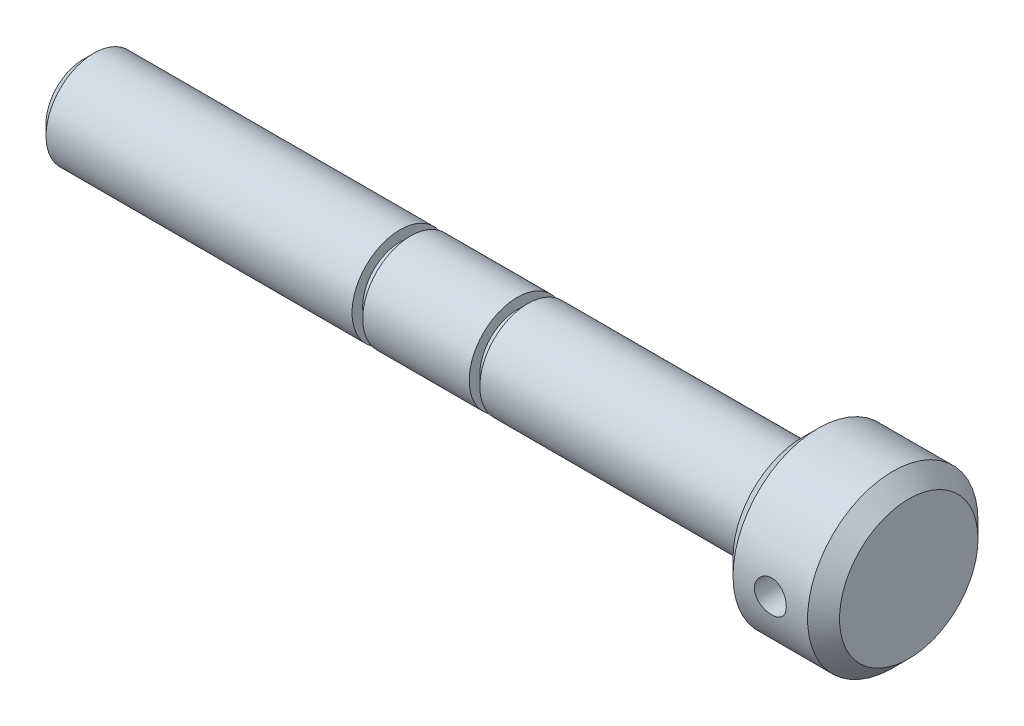
ISO-10303-21;
HEADER;
FILE_DESCRIPTION(('STEP AP214'),'2;1');
FILE_NAME('part.step','',(''),(''),'','','');
FILE_SCHEMA(('AUTOMOTIVE_DESIGN { 1 0 10303 214 1 1 1 1 }'));
ENDSEC;
DATA;
#1=APPLICATION_CONTEXT('core data for automotive mechanical design processes');
#2=APPLICATION_PROTOCOL_DEFINITION('international standard','automotive_design',2000,#1);
#3=PRODUCT_CONTEXT('',#1,'mechanical');
#4=PRODUCT('Part','Part','',(#3));
#5=PRODUCT_RELATED_PRODUCT_CATEGORY('part','',(#4));
#6=PRODUCT_DEFINITION_FORMATION('','',#4);
#7=PRODUCT_DEFINITION_CONTEXT('part definition',#1,'design');
#8=PRODUCT_DEFINITION('design','',#6,#7);
#9=PRODUCT_DEFINITION_SHAPE('','',#8);
#10=(LENGTH_UNIT() NAMED_UNIT(*) SI_UNIT(.MILLI.,.METRE.));
#11=(NAMED_UNIT(*) PLANE_ANGLE_UNIT() SI_UNIT($,.RADIAN.));
#12=(NAMED_UNIT(*) SI_UNIT($,.STERADIAN.) SOLID_ANGLE_UNIT());
#13=UNCERTAINTY_MEASURE_WITH_UNIT(LENGTH_MEASURE(1.E-05),#10,'distance_accuracy_value','');
#14=(GEOMETRIC_REPRESENTATION_CONTEXT(3) GLOBAL_UNCERTAINTY_ASSIGNED_CONTEXT((#13)) GLOBAL_UNIT_ASSIGNED_CONTEXT((#10,
#11,#12)) REPRESENTATION_CONTEXT('',''));
#15=CARTESIAN_POINT('',(0.,0.,0.));
#16=DIRECTION('',(0.,0.,1.));
#17=DIRECTION('',(1.,0.,0.));
#18=AXIS2_PLACEMENT_3D('',#15,#16,#17);
#19=CARTESIAN_POINT('',(0.,0.,0.));
#20=DIRECTION('',(-1.,0.,0.));
#21=DIRECTION('',(0.,0.,1.));
#22=AXIS2_PLACEMENT_3D('',#19,#20,#21);
#23=PLANE('',#22);
#24=CARTESIAN_POINT('',(0.,0.,0.));
#25=DIRECTION('',(-1.,0.,0.));
#26=DIRECTION('',(0.,0.,1.));
#27=AXIS2_PLACEMENT_3D('',#24,#25,#26);
#28=CIRCLE('',#27,6.99999999999992);
#29=CARTESIAN_POINT('',(0.,0.,6.99999999999992));
#30=VERTEX_POINT('',#29);
#31=EDGE_CURVE('E10',#30,#30,#28,.T.);
#32=ORIENTED_EDGE('',*,*,#31,.T.);
#33=EDGE_LOOP('',(#32));
#34=FACE_BOUND('',#33,.T.);
#35=ADVANCED_FACE('F45',(#34),#23,.T.);
#36=CARTESIAN_POINT('',(155.,0.,0.));
#37=DIRECTION('',(1.,0.,0.));
#38=DIRECTION('',(0.,0.,-1.));
#39=AXIS2_PLACEMENT_3D('',#36,#37,#38);
#40=CYLINDRICAL_SURFACE('',#39,9.);
#41=CARTESIAN_POINT('',(2.00000000000006,0.,0.));
#42=DIRECTION('',(-1.,0.,0.));
#43=DIRECTION('',(0.,0.,1.));
#44=AXIS2_PLACEMENT_3D('',#41,#42,#43);
#45=CIRCLE('',#44,9.);
#46=CARTESIAN_POINT('',(2.00000000000006,0.,9.));
#47=VERTEX_POINT('',#46);
#48=EDGE_CURVE('E59',#47,#47,#45,.F.);
#49=ORIENTED_EDGE('',*,*,#48,.T.);
#50=EDGE_LOOP('',(#49));
#51=FACE_BOUND('',#50,.T.);
#52=CARTESIAN_POINT('',(59.46,0.,0.));
#53=DIRECTION('',(1.,0.,0.));
#54=DIRECTION('',(0.,0.,-1.));
#55=AXIS2_PLACEMENT_3D('',#52,#53,#54);
#56=CIRCLE('',#55,9.);
#57=CARTESIAN_POINT('',(59.46,0.,-9.));
#58=VERTEX_POINT('',#57);
#59=EDGE_CURVE('E131',#58,#58,#56,.T.);
#60=ORIENTED_EDGE('',*,*,#59,.F.);
#61=EDGE_LOOP('',(#60));
#62=FACE_BOUND('',#61,.T.);
#63=ADVANCED_FACE('F96',(#51,#62),#40,.T.);
#64=CARTESIAN_POINT('',(59.46,9.,0.));
#65=DIRECTION('',(1.,0.,0.));
#66=DIRECTION('',(0.,0.,-1.));
#67=AXIS2_PLACEMENT_3D('',#64,#65,#66);
#68=PLANE('',#67);
#69=ORIENTED_EDGE('',*,*,#59,.T.);
#70=EDGE_LOOP('',(#69));
#71=FACE_BOUND('',#70,.T.);
#72=CARTESIAN_POINT('',(59.46,0.,0.));
#73=DIRECTION('',(1.,0.,0.));
#74=DIRECTION('',(0.,0.,-1.));
#75=AXIS2_PLACEMENT_3D('',#72,#73,#74);
#76=CIRCLE('',#75,7.);
#77=CARTESIAN_POINT('',(59.46,0.,-7.));
#78=VERTEX_POINT('',#77);
#79=EDGE_CURVE('E134',#78,#78,#76,.T.);
#80=ORIENTED_EDGE('',*,*,#79,.F.);
#81=EDGE_LOOP('',(#80));
#82=FACE_BOUND('',#81,.T.);
#83=ADVANCED_FACE('F101',(#71,#82),#68,.T.);
#84=CARTESIAN_POINT('',(155.,0.,0.));
#85=DIRECTION('',(1.,0.,0.));
#86=DIRECTION('',(0.,0.,-1.));
#87=AXIS2_PLACEMENT_3D('',#84,#85,#86);
#88=CYLINDRICAL_SURFACE('',#87,7.);
#89=ORIENTED_EDGE('',*,*,#79,.T.);
#90=EDGE_LOOP('',(#89));
#91=FACE_BOUND('',#90,.T.);
#92=CARTESIAN_POINT('',(61.46,0.,0.));
#93=DIRECTION('',(1.,0.,0.));
#94=DIRECTION('',(0.,0.,-1.));
#95=AXIS2_PLACEMENT_3D('',#92,#93,#94);
#96=CIRCLE('',#95,7.);
#97=CARTESIAN_POINT('',(61.46,0.,-7.));
#98=VERTEX_POINT('',#97);
#99=EDGE_CURVE('E137',#98,#98,#96,.T.);
#100=ORIENTED_EDGE('',*,*,#99,.F.);
#101=EDGE_LOOP('',(#100));
#102=FACE_BOUND('',#101,.T.);
#103=ADVANCED_FACE('F197',(#91,#102),#88,.T.);
#104=CARTESIAN_POINT('',(61.46,7.,0.));
#105=DIRECTION('',(-1.,0.,0.));
#106=DIRECTION('',(0.,0.,1.));
#107=AXIS2_PLACEMENT_3D('',#104,#105,#106);
#108=PLANE('',#107);
#109=ORIENTED_EDGE('',*,*,#99,.T.);
#110=EDGE_LOOP('',(#109));
#111=FACE_BOUND('',#110,.T.);
#112=CARTESIAN_POINT('',(61.46,0.,0.));
#113=DIRECTION('',(1.,0.,0.));
#114=DIRECTION('',(0.,0.,-1.));
#115=AXIS2_PLACEMENT_3D('',#112,#113,#114);
#116=CIRCLE('',#115,9.);
#117=CARTESIAN_POINT('',(61.46,0.,-9.));
#118=VERTEX_POINT('',#117);
#119=EDGE_CURVE('E140',#118,#118,#116,.T.);
#120=ORIENTED_EDGE('',*,*,#119,.F.);
#121=EDGE_LOOP('',(#120));
#122=FACE_BOUND('',#121,.T.);
#123=ADVANCED_FACE('F193',(#111,#122),#108,.T.);
#124=CARTESIAN_POINT('',(155.,0.,0.));
#125=DIRECTION('',(1.,0.,0.));
#126=DIRECTION('',(0.,0.,-1.));
#127=AXIS2_PLACEMENT_3D('',#124,#125,#126);
#128=CYLINDRICAL_SURFACE('',#127,9.);
#129=ORIENTED_EDGE('',*,*,#119,.T.);
#130=EDGE_LOOP('',(#129));
#131=FACE_BOUND('',#130,.T.);
#132=CARTESIAN_POINT('',(81.46,0.,0.));
#133=DIRECTION('',(1.,0.,0.));
#134=DIRECTION('',(0.,0.,-1.));
#135=AXIS2_PLACEMENT_3D('',#132,#133,#134);
#136=CIRCLE('',#135,9.);
#137=CARTESIAN_POINT('',(81.46,0.,-9.));
#138=VERTEX_POINT('',#137);
#139=EDGE_CURVE('E143',#138,#138,#136,.T.);
#140=ORIENTED_EDGE('',*,*,#139,.F.);
#141=EDGE_LOOP('',(#140));
#142=FACE_BOUND('',#141,.T.);
#143=ADVANCED_FACE('F189',(#131,#142),#128,.T.);
#144=CARTESIAN_POINT('',(81.46,9.,0.));
#145=DIRECTION('',(1.,0.,0.));
#146=DIRECTION('',(0.,0.,-1.));
#147=AXIS2_PLACEMENT_3D('',#144,#145,#146);
#148=PLANE('',#147);
#149=ORIENTED_EDGE('',*,*,#139,.T.);
#150=EDGE_LOOP('',(#149));
#151=FACE_BOUND('',#150,.T.);
#152=CARTESIAN_POINT('',(81.46,0.,0.));
#153=DIRECTION('',(1.,0.,0.));
#154=DIRECTION('',(0.,0.,-1.));
#155=AXIS2_PLACEMENT_3D('',#152,#153,#154);
#156=CIRCLE('',#155,7.);
#157=CARTESIAN_POINT('',(81.46,0.,-7.));
#158=VERTEX_POINT('',#157);
#159=EDGE_CURVE('E146',#158,#158,#156,.T.);
#160=ORIENTED_EDGE('',*,*,#159,.F.);
#161=EDGE_LOOP('',(#160));
#162=FACE_BOUND('',#161,.T.);
#163=ADVANCED_FACE('F185',(#151,#162),#148,.T.);
#164=CARTESIAN_POINT('',(155.,0.,0.));
#165=DIRECTION('',(1.,0.,0.));
#166=DIRECTION('',(0.,0.,-1.));
#167=AXIS2_PLACEMENT_3D('',#164,#165,#166);
#168=CYLINDRICAL_SURFACE('',#167,7.);
#169=ORIENTED_EDGE('',*,*,#159,.T.);
#170=EDGE_LOOP('',(#169));
#171=FACE_BOUND('',#170,.T.);
#172=CARTESIAN_POINT('',(83.46,0.,0.));
#173=DIRECTION('',(1.,0.,0.));
#174=DIRECTION('',(0.,0.,-1.));
#175=AXIS2_PLACEMENT_3D('',#172,#173,#174);
#176=CIRCLE('',#175,7.);
#177=CARTESIAN_POINT('',(83.46,0.,-7.));
#178=VERTEX_POINT('',#177);
#179=EDGE_CURVE('E149',#178,#178,#176,.T.);
#180=ORIENTED_EDGE('',*,*,#179,.F.);
#181=EDGE_LOOP('',(#180));
#182=FACE_BOUND('',#181,.T.);
#183=ADVANCED_FACE('F179',(#171,#182),#168,.T.);
#184=CARTESIAN_POINT('',(83.46,7.,0.));
#185=DIRECTION('',(-1.,0.,0.));
#186=DIRECTION('',(0.,0.,1.));
#187=AXIS2_PLACEMENT_3D('',#184,#185,#186);
#188=PLANE('',#187);
#189=ORIENTED_EDGE('',*,*,#179,.T.);
#190=EDGE_LOOP('',(#189));
#191=FACE_BOUND('',#190,.T.);
#192=CARTESIAN_POINT('',(83.46,0.,0.));
#193=DIRECTION('',(1.,0.,0.));
#194=DIRECTION('',(0.,0.,-1.));
#195=AXIS2_PLACEMENT_3D('',#192,#193,#194);
#196=CIRCLE('',#195,9.);
#197=CARTESIAN_POINT('',(83.46,0.,-9.));
#198=VERTEX_POINT('',#197);
#199=EDGE_CURVE('E152',#198,#198,#196,.T.);
#200=ORIENTED_EDGE('',*,*,#199,.F.);
#201=EDGE_LOOP('',(#200));
#202=FACE_BOUND('',#201,.T.);
#203=ADVANCED_FACE('F171',(#191,#202),#188,.T.);
#204=CARTESIAN_POINT('',(155.,0.,0.));
#205=DIRECTION('',(1.,0.,0.));
#206=DIRECTION('',(0.,0.,-1.));
#207=AXIS2_PLACEMENT_3D('',#204,#205,#206);
#208=CYLINDRICAL_SURFACE('',#207,9.);
#209=ORIENTED_EDGE('',*,*,#199,.T.);
#210=EDGE_LOOP('',(#209));
#211=FACE_BOUND('',#210,.T.);
#212=CARTESIAN_POINT('',(135.,0.,0.));
#213=DIRECTION('',(1.,0.,0.));
#214=DIRECTION('',(0.,0.,-1.));
#215=AXIS2_PLACEMENT_3D('',#212,#213,#214);
#216=CIRCLE('',#215,9.);
#217=CARTESIAN_POINT('',(135.,0.,-9.));
#218=VERTEX_POINT('',#217);
#219=EDGE_CURVE('E155',#218,#218,#216,.T.);
#220=ORIENTED_EDGE('',*,*,#219,.F.);
#221=EDGE_LOOP('',(#220));
#222=FACE_BOUND('',#221,.T.);
#223=ADVANCED_FACE('F169',(#211,#222),#208,.T.);
#224=CARTESIAN_POINT('',(135.,9.,0.));
#225=DIRECTION('',(-1.,0.,0.));
#226=DIRECTION('',(0.,0.,1.));
#227=AXIS2_PLACEMENT_3D('',#224,#225,#226);
#228=PLANE('',#227);
#229=CARTESIAN_POINT('',(135.,0.,0.));
#230=DIRECTION('',(-1.,0.,0.));
#231=DIRECTION('',(0.,0.,1.));
#232=AXIS2_PLACEMENT_3D('',#229,#230,#231);
#233=CIRCLE('',#232,13.);
#234=CARTESIAN_POINT('',(135.,0.,13.));
#235=VERTEX_POINT('',#234);
#236=EDGE_CURVE('E64',#235,#235,#233,.T.);
#237=ORIENTED_EDGE('',*,*,#236,.T.);
#238=EDGE_LOOP('',(#237));
#239=FACE_BOUND('',#238,.T.);
#240=ORIENTED_EDGE('',*,*,#219,.T.);
#241=EDGE_LOOP('',(#240));
#242=FACE_BOUND('',#241,.T.);
#243=ADVANCED_FACE('F92',(#239,#242),#228,.T.);
#244=CARTESIAN_POINT('',(155.,0.,0.));
#245=DIRECTION('',(1.,0.,0.));
#246=DIRECTION('',(0.,0.,-1.));
#247=AXIS2_PLACEMENT_3D('',#244,#245,#246);
#248=CYLINDRICAL_SURFACE('',#247,16.);
#249=CARTESIAN_POINT('',(142.,0.,-16.));
#250=CARTESIAN_POINT('',(142.000006379177,0.166943492930942,-15.999996976677));
#251=CARTESIAN_POINT('',(142.013982153239,0.333969985460197,-15.9973601984343));
#252=CARTESIAN_POINT('',(142.069479990237,0.663316259683595,-15.9870957178104));
#253=CARTESIAN_POINT('',(142.11102530128,0.825631948304451,-15.9794638033379));
#254=CARTESIAN_POINT('',(142.220345402519,1.14074592370361,-15.9600627753092));
#255=CARTESIAN_POINT('',(142.288096504905,1.2935526613707,-15.9482973989297));
#256=CARTESIAN_POINT('',(142.447837753846,1.58561594618802,-15.9219142119957));
#257=CARTESIAN_POINT('',(142.53982593829,1.72487358895465,-15.9072966323658));
#258=CARTESIAN_POINT('',(142.746599536007,1.98756743186101,-15.8766267286101));
#259=CARTESIAN_POINT('',(142.86161888934,2.11081791006367,-15.860560697127));
#260=CARTESIAN_POINT('',(143.110686618175,2.33639212270739,-15.828906369173));
#261=CARTESIAN_POINT('',(143.244736359539,2.43871435378483,-15.8133181070906));
#262=CARTESIAN_POINT('',(143.529372176728,2.62029997331586,-15.7842510249001));
#263=CARTESIAN_POINT('',(143.680080740635,2.69937443939211,-15.7707898777236));
#264=CARTESIAN_POINT('',(143.992937830354,2.83101048664566,-15.7476942642397));
#265=CARTESIAN_POINT('',(144.155085368222,2.88357435426196,-15.7380594679392));
#266=CARTESIAN_POINT('',(144.484230461829,2.96010107007,-15.723845391491));
#267=CARTESIAN_POINT('',(144.651150194407,2.98438780384078,-15.7192089073281));
#268=CARTESIAN_POINT('',(144.986754769617,3.00467616190692,-15.7153439430552));
#269=CARTESIAN_POINT('',(145.155439452605,3.00068032270747,-15.7161149779752));
#270=CARTESIAN_POINT('',(145.487439050532,2.96477959204724,-15.7229258540351));
#271=CARTESIAN_POINT('',(145.6507954286,2.93324299992089,-15.7288961629467));
#272=CARTESIAN_POINT('',(145.969856839565,2.84373598792413,-15.7453236656933));
#273=CARTESIAN_POINT('',(146.125561547019,2.78576444478997,-15.7557810501903));
#274=CARTESIAN_POINT('',(146.425977358001,2.64467294358599,-15.7800771058518));
#275=CARTESIAN_POINT('',(146.570616941162,2.56140427064911,-15.7939356764673));
#276=CARTESIAN_POINT('',(146.84400945708,2.37218737860832,-15.8234594320584));
#277=CARTESIAN_POINT('',(146.97276077543,2.26623685778531,-15.8391248003104));
#278=CARTESIAN_POINT('',(147.212849911345,2.03267811370594,-15.8708000254433));
#279=CARTESIAN_POINT('',(147.323881304904,1.90475487372135,-15.8868114204806));
#280=CARTESIAN_POINT('',(147.522954481351,1.63193607419765,-15.9171477221664));
#281=CARTESIAN_POINT('',(147.610996033741,1.48704034451154,-15.9314726119049));
#282=CARTESIAN_POINT('',(147.76163550774,1.18406997774933,-15.9568507935502));
#283=CARTESIAN_POINT('',(147.824201558236,1.02597912889298,-15.9678999827258));
#284=CARTESIAN_POINT('',(147.921804186184,0.701278230797383,-15.9854501080544));
#285=CARTESIAN_POINT('',(147.956843688091,0.534669088555564,-15.9919515273599));
#286=CARTESIAN_POINT('',(147.997972062037,0.200297305806761,-15.9996072128396));
#287=CARTESIAN_POINT('',(148.004480783059,0.032588025268261,-16.0008390182456));
#288=CARTESIAN_POINT('',(147.989489040905,-0.301522496184375,-15.9980308719646));
#289=CARTESIAN_POINT('',(147.96798995387,-0.467923800960776,-15.9939911792886));
#290=CARTESIAN_POINT('',(147.897941929633,-0.793363146436439,-15.9811422300081));
#291=CARTESIAN_POINT('',(147.849605434924,-0.952448522092132,-15.9723704474806));
#292=CARTESIAN_POINT('',(147.727484586442,-1.26025726364927,-15.95103684425));
#293=CARTESIAN_POINT('',(147.653698504868,-1.4089799251902,-15.9384747662267));
#294=CARTESIAN_POINT('',(147.481843743681,-1.69363334302642,-15.9107606071533));
#295=CARTESIAN_POINT('',(147.383518522926,-1.82940655403024,-15.8955817234913));
#296=CARTESIAN_POINT('',(147.165723725275,-2.08267664652909,-15.8643868697942));
#297=CARTESIAN_POINT('',(147.046252173997,-2.20017181952174,-15.8483708216937));
#298=CARTESIAN_POINT('',(146.787655362177,-2.41514591744096,-15.817049513949));
#299=CARTESIAN_POINT('',(146.648290183749,-2.51233832437154,-15.8017565172051));
#300=CARTESIAN_POINT('',(146.354964750952,-2.68193350115574,-15.7738597115706));
#301=CARTESIAN_POINT('',(146.201005039259,-2.75433719227848,-15.761255802747));
#302=CARTESIAN_POINT('',(145.883588265515,-2.87189347025646,-15.7402604841915));
#303=CARTESIAN_POINT('',(145.720181240881,-2.91717737589572,-15.7318488087376));
#304=CARTESIAN_POINT('',(145.387905554957,-2.9796135865247,-15.7201440760483));
#305=CARTESIAN_POINT('',(145.219037512059,-2.99676906541416,-15.7168504413158));
#306=CARTESIAN_POINT('',(144.883503337117,-3.00235524296709,-15.7157839960771));
#307=CARTESIAN_POINT('',(144.716844838086,-2.99123790006997,-15.7179243194859));
#308=CARTESIAN_POINT('',(144.387817155909,-2.94158350757606,-15.7272920132));
#309=CARTESIAN_POINT('',(144.225447947145,-2.90304662178664,-15.7345193531149));
#310=CARTESIAN_POINT('',(143.909851030409,-2.79983775166526,-15.7532101604636));
#311=CARTESIAN_POINT('',(143.756606817308,-2.73521470794505,-15.7646656918993));
#312=CARTESIAN_POINT('',(143.463063491518,-2.58171737824409,-15.7905277510368));
#313=CARTESIAN_POINT('',(143.32276529431,-2.49284137896372,-15.8049344872024));
#314=CARTESIAN_POINT('',(143.056832639915,-2.29178974679071,-15.8353453221549));
#315=CARTESIAN_POINT('',(142.931449174866,-2.17928519728607,-15.8513701070609));
#316=CARTESIAN_POINT('',(142.701189675071,-1.93485585348458,-15.8830566783747));
#317=CARTESIAN_POINT('',(142.59631835804,-1.80292660378324,-15.8987183805466));
#318=CARTESIAN_POINT('',(142.409178094746,-1.52196989014375,-15.928079519361));
#319=CARTESIAN_POINT('',(142.327121143019,-1.37279918128103,-15.9417600198112));
#320=CARTESIAN_POINT('',(142.18936472679,-1.06258022730767,-15.9654323876137));
#321=CARTESIAN_POINT('',(142.133640505906,-0.901543303410499,-15.9754277175807));
#322=CARTESIAN_POINT('',(142.061445371163,-0.616694405650313,-15.9885658141526));
#323=CARTESIAN_POINT('',(142.038442739374,-0.494547620503746,-15.9928294175641));
#324=CARTESIAN_POINT('',(142.007717875767,-0.248282494230318,-15.9985475990802));
#325=CARTESIAN_POINT('',(141.999995255488,-0.12416420330542,-16.0000022485961));
#326=CARTESIAN_POINT('',(142.,0.,-16.));
#327=B_SPLINE_CURVE_WITH_KNOTS('',3,(#249,#250,#251,#252,#253,#254,#255,#256,#257,#258,#259,
#260,#261,#262,#263,#264,#265,#266,#267,#268,#269,#270,#271,#272,#273,#274,#275,#276,#277,#278,
#279,#280,#281,#282,#283,#284,#285,#286,#287,#288,#289,#290,#291,#292,#293,#294,#295,#296,#297,
#298,#299,#300,#301,#302,#303,#304,#305,#306,#307,#308,#309,#310,#311,#312,#313,#314,#315,#316,
#317,#318,#319,#320,#321,#322,#323,#324,#325,#326),.UNSPECIFIED.,.T.,.F.,(4,2,2,2,2,2,2,2,2,2,2,
2,2,2,2,2,2,2,2,2,2,2,2,2,2,2,2,2,2,2,2,2,2,2,2,2,2,2,4),(0.,0.50037640192985,1.0011752850709,
1.50152254246182,2.00182930673783,2.50750236027263,3.01321172567232,3.52292381008718,
4.03259192623896,4.53636302890672,5.04008895174511,5.53718001225533,6.03429219693572,
6.53438525259059,7.03452908099719,7.54255536928153,8.05058675089894,8.55925176643396,
9.0678627334749,9.56896348152192,10.0700396092917,10.5672046781565,11.0644035067606,
11.5670355603541,12.069714568262,12.579068739746,13.0884039790989,13.5952525563712,
14.1020439389302,14.6007850446349,15.0995231708301,15.5973299241538,16.0951718531084,
16.6004673993276,17.1058790252451,17.6158409783263,18.1253225386234,18.4974868904881,
18.8696417807908),.UNSPECIFIED.);
#328=CARTESIAN_POINT('',(142.,0.,-16.));
#329=VERTEX_POINT('',#328);
#330=EDGE_CURVE('E50',#329,#329,#327,.T.);
#331=ORIENTED_EDGE('',*,*,#330,.F.);
#332=EDGE_LOOP('',(#331));
#333=FACE_BOUND('',#332,.T.);
#334=CARTESIAN_POINT('',(148.,0.,16.));
#335=CARTESIAN_POINT('',(147.999993620823,0.166943492930942,15.999996976677));
#336=CARTESIAN_POINT('',(147.986017846761,0.333969985460197,15.9973601984343));
#337=CARTESIAN_POINT('',(147.930520009763,0.663316259683595,15.9870957178104));
#338=CARTESIAN_POINT('',(147.888974698721,0.825631948304451,15.9794638033379));
#339=CARTESIAN_POINT('',(147.779654597481,1.14074592370361,15.9600627753092));
#340=CARTESIAN_POINT('',(147.711903495095,1.2935526613707,15.9482973989297));
#341=CARTESIAN_POINT('',(147.552162246154,1.58561594618802,15.9219142119957));
#342=CARTESIAN_POINT('',(147.46017406171,1.72487358895465,15.9072966323658));
#343=CARTESIAN_POINT('',(147.253400463993,1.98756743186101,15.8766267286101));
#344=CARTESIAN_POINT('',(147.13838111066,2.11081791006367,15.860560697127));
#345=CARTESIAN_POINT('',(146.889313381825,2.33639212270738,15.828906369173));
#346=CARTESIAN_POINT('',(146.755263640461,2.43871435378483,15.8133181070906));
#347=CARTESIAN_POINT('',(146.470627823272,2.62029997331585,15.7842510249001));
#348=CARTESIAN_POINT('',(146.319919259366,2.6993744393921,15.7707898777236));
#349=CARTESIAN_POINT('',(146.007062169646,2.83101048664565,15.7476942642397));
#350=CARTESIAN_POINT('',(145.844914631778,2.88357435426196,15.7380594679392));
#351=CARTESIAN_POINT('',(145.515769538171,2.96010107007,15.723845391491));
#352=CARTESIAN_POINT('',(145.348849805593,2.98438780384078,15.7192089073281));
#353=CARTESIAN_POINT('',(145.013245230383,3.00467616190692,15.7153439430552));
#354=CARTESIAN_POINT('',(144.844560547395,3.00068032270747,15.7161149779752));
#355=CARTESIAN_POINT('',(144.512560949468,2.96477959204724,15.7229258540351));
#356=CARTESIAN_POINT('',(144.3492045714,2.93324299992089,15.7288961629467));
#357=CARTESIAN_POINT('',(144.030143160435,2.84373598792413,15.7453236656933));
#358=CARTESIAN_POINT('',(143.874438452981,2.78576444478997,15.7557810501903));
#359=CARTESIAN_POINT('',(143.574022642,2.64467294358599,15.7800771058518));
#360=CARTESIAN_POINT('',(143.429383058838,2.56140427064911,15.7939356764673));
#361=CARTESIAN_POINT('',(143.15599054292,2.37218737860832,15.8234594320584));
#362=CARTESIAN_POINT('',(143.02723922457,2.26623685778531,15.8391248003104));
#363=CARTESIAN_POINT('',(142.787150088655,2.03267811370594,15.8708000254433));
#364=CARTESIAN_POINT('',(142.676118695097,1.90475487372136,15.8868114204806));
#365=CARTESIAN_POINT('',(142.477045518649,1.63193607419766,15.9171477221664));
#366=CARTESIAN_POINT('',(142.389003966259,1.48704034451154,15.9314726119049));
#367=CARTESIAN_POINT('',(142.23836449226,1.18406997774933,15.9568507935502));
#368=CARTESIAN_POINT('',(142.175798441764,1.02597912889298,15.9678999827258));
#369=CARTESIAN_POINT('',(142.078195813816,0.701278230797383,15.9854501080544));
#370=CARTESIAN_POINT('',(142.043156311909,0.534669088555564,15.9919515273599));
#371=CARTESIAN_POINT('',(142.002027937963,0.200297305806761,15.9996072128396));
#372=CARTESIAN_POINT('',(141.995519216941,0.032588025268261,16.0008390182456));
#373=CARTESIAN_POINT('',(142.010510959095,-0.301522496184375,15.9980308719646));
#374=CARTESIAN_POINT('',(142.032010046131,-0.467923800960776,15.9939911792886));
#375=CARTESIAN_POINT('',(142.102058070367,-0.793363146436439,15.9811422300081));
#376=CARTESIAN_POINT('',(142.150394565076,-0.952448522092132,15.9723704474806));
#377=CARTESIAN_POINT('',(142.272515413558,-1.26025726364927,15.95103684425));
#378=CARTESIAN_POINT('',(142.346301495132,-1.4089799251902,15.9384747662267));
#379=CARTESIAN_POINT('',(142.518156256319,-1.69363334302642,15.9107606071533));
#380=CARTESIAN_POINT('',(142.616481477074,-1.82940655403024,15.8955817234913));
#381=CARTESIAN_POINT('',(142.834276274725,-2.08267664652909,15.8643868697942));
#382=CARTESIAN_POINT('',(142.953747826003,-2.20017181952174,15.8483708216937));
#383=CARTESIAN_POINT('',(143.212344637823,-2.41514591744096,15.817049513949));
#384=CARTESIAN_POINT('',(143.351709816251,-2.51233832437154,15.8017565172051));
#385=CARTESIAN_POINT('',(143.645035249048,-2.68193350115574,15.7738597115706));
#386=CARTESIAN_POINT('',(143.798994960741,-2.75433719227848,15.761255802747));
#387=CARTESIAN_POINT('',(144.116411734485,-2.87189347025646,15.7402604841915));
#388=CARTESIAN_POINT('',(144.279818759119,-2.91717737589572,15.7318488087376));
#389=CARTESIAN_POINT('',(144.612094445043,-2.9796135865247,15.7201440760483));
#390=CARTESIAN_POINT('',(144.780962487941,-2.99676906541416,15.7168504413158));
#391=CARTESIAN_POINT('',(145.116496662883,-3.00235524296709,15.7157839960771));
#392=CARTESIAN_POINT('',(145.283155161914,-2.99123790006997,15.7179243194859));
#393=CARTESIAN_POINT('',(145.612182844091,-2.94158350757605,15.7272920132));
#394=CARTESIAN_POINT('',(145.774552052855,-2.90304662178663,15.7345193531149));
#395=CARTESIAN_POINT('',(146.090148969591,-2.79983775166526,15.7532101604636));
#396=CARTESIAN_POINT('',(146.243393182692,-2.73521470794505,15.7646656918993));
#397=CARTESIAN_POINT('',(146.536936508482,-2.58171737824409,15.7905277510368));
#398=CARTESIAN_POINT('',(146.67723470569,-2.49284137896372,15.8049344872024));
#399=CARTESIAN_POINT('',(146.943167360085,-2.29178974679071,15.8353453221549));
#400=CARTESIAN_POINT('',(147.068550825134,-2.17928519728607,15.8513701070609));
#401=CARTESIAN_POINT('',(147.298810324929,-1.93485585348458,15.8830566783747));
#402=CARTESIAN_POINT('',(147.40368164196,-1.80292660378324,15.8987183805466));
#403=CARTESIAN_POINT('',(147.590821905254,-1.52196989014375,15.928079519361));
#404=CARTESIAN_POINT('',(147.672878856981,-1.37279918128103,15.9417600198112));
#405=CARTESIAN_POINT('',(147.81063527321,-1.06258022730767,15.9654323876137));
#406=CARTESIAN_POINT('',(147.866359494094,-0.901543303410499,15.9754277175807));
#407=CARTESIAN_POINT('',(147.938554628837,-0.616694405650313,15.9885658141526));
#408=CARTESIAN_POINT('',(147.961557260626,-0.494547620503746,15.9928294175641));
#409=CARTESIAN_POINT('',(147.992282124233,-0.248282494230318,15.9985475990802));
#410=CARTESIAN_POINT('',(148.000004744512,-0.12416420330542,16.0000022485961));
#411=CARTESIAN_POINT('',(148.,0.,16.));
#412=B_SPLINE_CURVE_WITH_KNOTS('',3,(#334,#335,#336,#337,#338,#339,#340,#341,#342,#343,#344,
#345,#346,#347,#348,#349,#350,#351,#352,#353,#354,#355,#356,#357,#358,#359,#360,#361,#362,#363,
#364,#365,#366,#367,#368,#369,#370,#371,#372,#373,#374,#375,#376,#377,#378,#379,#380,#381,#382,
#383,#384,#385,#386,#387,#388,#389,#390,#391,#392,#393,#394,#395,#396,#397,#398,#399,#400,#401,
#402,#403,#404,#405,#406,#407,#408,#409,#410,#411),.UNSPECIFIED.,.T.,.F.,(4,2,2,2,2,2,2,2,2,2,2,
2,2,2,2,2,2,2,2,2,2,2,2,2,2,2,2,2,2,2,2,2,2,2,2,2,2,2,4),(0.,0.50037640192985,1.0011752850709,
1.50152254246182,2.00182930673783,2.50750236027263,3.01321172567232,3.52292381008715,
4.03259192623896,4.53636302890672,5.04008895174511,5.53718001225533,6.03429219693572,
6.53438525259059,7.03452908099719,7.54255536928152,8.05058675089894,8.55925176643396,
9.0678627334749,9.56896348152192,10.0700396092917,10.5672046781565,11.0644035067606,
11.5670355603541,12.069714568262,12.579068739746,13.0884039790989,13.5952525563712,
14.1020439389302,14.6007850446349,15.0995231708301,15.5973299241538,16.0951718531084,
16.6004673993276,17.1058790252451,17.6158409783263,18.1253225386234,18.4974868904881,
18.8696417807908),.UNSPECIFIED.);
#413=CARTESIAN_POINT('',(148.,0.,16.));
#414=VERTEX_POINT('',#413);
#415=EDGE_CURVE('E67',#414,#414,#412,.T.);
#416=ORIENTED_EDGE('',*,*,#415,.F.);
#417=EDGE_LOOP('',(#416));
#418=FACE_BOUND('',#417,.T.);
#419=CARTESIAN_POINT('',(138.,0.,0.));
#420=DIRECTION('',(-1.,0.,0.));
#421=DIRECTION('',(0.,0.,1.));
#422=AXIS2_PLACEMENT_3D('',#419,#420,#421);
#423=CIRCLE('',#422,16.);
#424=CARTESIAN_POINT('',(138.,0.,16.));
#425=VERTEX_POINT('',#424);
#426=EDGE_CURVE('E122',#425,#425,#423,.F.);
#427=ORIENTED_EDGE('',*,*,#426,.T.);
#428=EDGE_LOOP('',(#427));
#429=FACE_BOUND('',#428,.T.);
#430=CARTESIAN_POINT('',(152.,0.,0.));
#431=DIRECTION('',(1.,0.,0.));
#432=DIRECTION('',(0.,0.,-1.));
#433=AXIS2_PLACEMENT_3D('',#430,#431,#432);
#434=CIRCLE('',#433,16.);
#435=CARTESIAN_POINT('',(152.,0.,-16.));
#436=VERTEX_POINT('',#435);
#437=EDGE_CURVE('E124',#436,#436,#434,.F.);
#438=ORIENTED_EDGE('',*,*,#437,.T.);
#439=EDGE_LOOP('',(#438));
#440=FACE_BOUND('',#439,.T.);
#441=ADVANCED_FACE('F72',(#333,#418,#429,#440),#248,.T.);
#442=CARTESIAN_POINT('',(155.,16.,0.));
#443=DIRECTION('',(1.,0.,0.));
#444=DIRECTION('',(0.,0.,-1.));
#445=AXIS2_PLACEMENT_3D('',#442,#443,#444);
#446=PLANE('',#445);
#447=CARTESIAN_POINT('',(155.,0.,0.));
#448=DIRECTION('',(1.,0.,0.));
#449=DIRECTION('',(0.,0.,-1.));
#450=AXIS2_PLACEMENT_3D('',#447,#448,#449);
#451=CIRCLE('',#450,13.);
#452=CARTESIAN_POINT('',(155.,0.,-13.));
#453=VERTEX_POINT('',#452);
#454=EDGE_CURVE('E127',#453,#453,#451,.T.);
#455=ORIENTED_EDGE('',*,*,#454,.T.);
#456=EDGE_LOOP('',(#455));
#457=FACE_BOUND('',#456,.T.);
#458=ADVANCED_FACE('F80',(#457),#446,.T.);
#459=CARTESIAN_POINT('',(155.,0.,0.));
#460=DIRECTION('',(-1.,0.,0.));
#461=DIRECTION('',(0.,0.,1.));
#462=AXIS2_PLACEMENT_3D('',#459,#460,#461);
#463=CONICAL_SURFACE('',#462,13.,0.785398163397437);
#464=ORIENTED_EDGE('',*,*,#437,.F.);
#465=EDGE_LOOP('',(#464));
#466=FACE_BOUND('',#465,.T.);
#467=ORIENTED_EDGE('',*,*,#454,.F.);
#468=EDGE_LOOP('',(#467));
#469=FACE_BOUND('',#468,.T.);
#470=ADVANCED_FACE('F83',(#466,#469),#463,.T.);
#471=CARTESIAN_POINT('',(138.,0.,0.));
#472=DIRECTION('',(1.,0.,0.));
#473=DIRECTION('',(0.,0.,-1.));
#474=AXIS2_PLACEMENT_3D('',#471,#472,#473);
#475=CONICAL_SURFACE('',#474,16.,0.785398163397446);
#476=ORIENTED_EDGE('',*,*,#236,.F.);
#477=EDGE_LOOP('',(#476));
#478=FACE_BOUND('',#477,.T.);
#479=ORIENTED_EDGE('',*,*,#426,.F.);
#480=EDGE_LOOP('',(#479));
#481=FACE_BOUND('',#480,.T.);
#482=ADVANCED_FACE('F89',(#478,#481),#475,.T.);
#483=CARTESIAN_POINT('',(2.00000000000006,0.,0.));
#484=DIRECTION('',(1.,0.,0.));
#485=DIRECTION('',(0.,0.,-1.));
#486=AXIS2_PLACEMENT_3D('',#483,#484,#485);
#487=CONICAL_SURFACE('',#486,9.,0.785398163397453);
#488=ORIENTED_EDGE('',*,*,#31,.F.);
#489=EDGE_LOOP('',(#488));
#490=FACE_BOUND('',#489,.T.);
#491=ORIENTED_EDGE('',*,*,#48,.F.);
#492=EDGE_LOOP('',(#491));
#493=FACE_BOUND('',#492,.T.);
#494=ADVANCED_FACE('F48',(#490,#493),#487,.T.);
#495=CARTESIAN_POINT('',(145.,0.,-50.));
#496=DIRECTION('',(0.,0.,1.));
#497=DIRECTION('',(1.,0.,0.));
#498=AXIS2_PLACEMENT_3D('',#495,#496,#497);
#499=CYLINDRICAL_SURFACE('',#498,2.99999999999999);
#500=ORIENTED_EDGE('',*,*,#330,.T.);
#501=EDGE_LOOP('',(#500));
#502=FACE_BOUND('',#501,.T.);
#503=ORIENTED_EDGE('',*,*,#415,.T.);
#504=EDGE_LOOP('',(#503));
#505=FACE_BOUND('',#504,.T.);
#506=ADVANCED_FACE('F76',(#502,#505),#499,.F.);
#507=CLOSED_SHELL('',(#35,#63,#83,#103,#123,#143,#163,#183,#203,#223,#243,#441,#458,#470,#482,
#494,#506));
#508=MANIFOLD_SOLID_BREP('B2',#507);
#509=ADVANCED_BREP_SHAPE_REPRESENTATION('',(#18,#508),#14);
#510=SHAPE_DEFINITION_REPRESENTATION(#9,#509);
ENDSEC;
END-ISO-10303-21;
